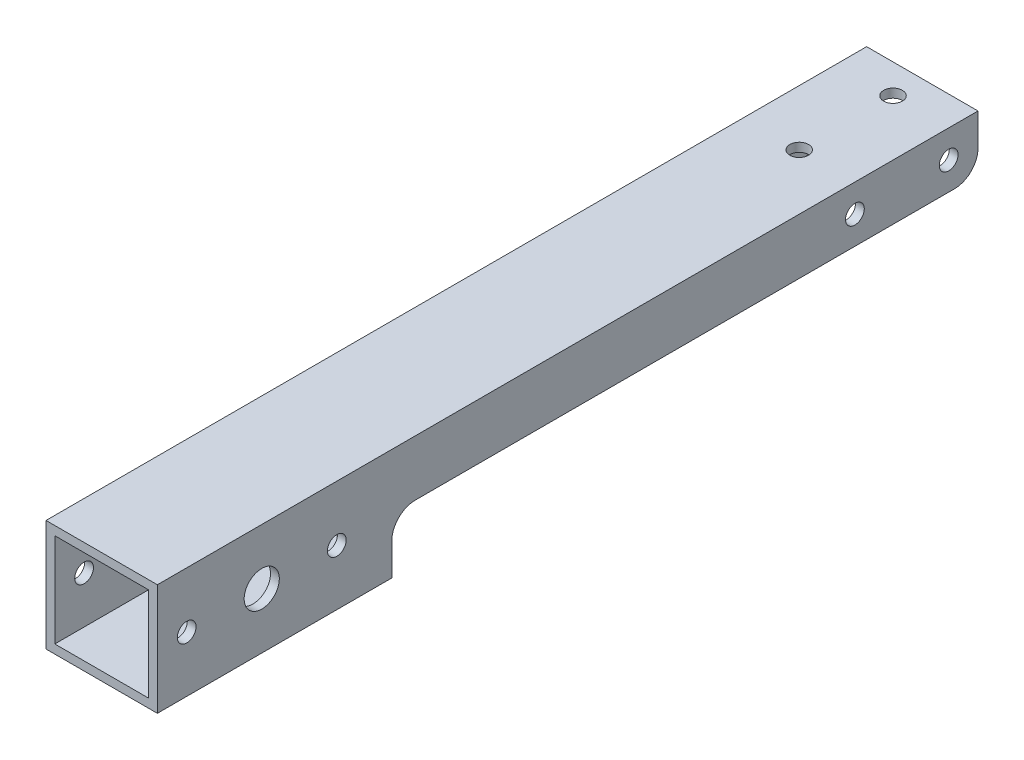
ISO-10303-21;
HEADER;
FILE_DESCRIPTION(('STEP AP214'),'2;1');
FILE_NAME('part.step','',(''),(''),'','','');
FILE_SCHEMA(('AUTOMOTIVE_DESIGN { 1 0 10303 214 1 1 1 1 }'));
ENDSEC;
DATA;
#1=APPLICATION_CONTEXT('core data for automotive mechanical design processes');
#2=APPLICATION_PROTOCOL_DEFINITION('international standard','automotive_design',2000,#1);
#3=PRODUCT_CONTEXT('',#1,'mechanical');
#4=PRODUCT('Part','Part','',(#3));
#5=PRODUCT_RELATED_PRODUCT_CATEGORY('part','',(#4));
#6=PRODUCT_DEFINITION_FORMATION('','',#4);
#7=PRODUCT_DEFINITION_CONTEXT('part definition',#1,'design');
#8=PRODUCT_DEFINITION('design','',#6,#7);
#9=PRODUCT_DEFINITION_SHAPE('','',#8);
#10=(LENGTH_UNIT() NAMED_UNIT(*) SI_UNIT(.MILLI.,.METRE.));
#11=(NAMED_UNIT(*) PLANE_ANGLE_UNIT() SI_UNIT($,.RADIAN.));
#12=(NAMED_UNIT(*) SI_UNIT($,.STERADIAN.) SOLID_ANGLE_UNIT());
#13=UNCERTAINTY_MEASURE_WITH_UNIT(LENGTH_MEASURE(1.E-05),#10,'distance_accuracy_value','');
#14=(GEOMETRIC_REPRESENTATION_CONTEXT(3) GLOBAL_UNCERTAINTY_ASSIGNED_CONTEXT((#13)) GLOBAL_UNIT_ASSIGNED_CONTEXT((#10,
#11,#12)) REPRESENTATION_CONTEXT('',''));
#15=CARTESIAN_POINT('',(0.,0.,0.));
#16=DIRECTION('',(0.,0.,1.));
#17=DIRECTION('',(1.,0.,0.));
#18=AXIS2_PLACEMENT_3D('',#15,#16,#17);
#19=CARTESIAN_POINT('',(-9.5,-9.5,140.));
#20=DIRECTION('',(0.,1.,0.));
#21=DIRECTION('',(0.,0.,1.));
#22=AXIS2_PLACEMENT_3D('',#19,#20,#21);
#23=PLANE('',#22);
#24=DIRECTION('',(1.,0.,0.));
#25=VECTOR('',#24,1.);
#26=CARTESIAN_POINT('',(-9.5,-9.5,100.));
#27=LINE('',#26,#25);
#28=CARTESIAN_POINT('',(-9.5,-9.5,100.));
#29=VERTEX_POINT('',#28);
#30=CARTESIAN_POINT('',(9.5,-9.5,100.));
#31=VERTEX_POINT('',#30);
#32=EDGE_CURVE('E173',#29,#31,#27,.T.);
#33=ORIENTED_EDGE('',*,*,#32,.T.);
#34=DIRECTION('',(0.,0.,-1.));
#35=VECTOR('',#34,1.);
#36=CARTESIAN_POINT('',(9.5,-9.5,140.));
#37=LINE('',#36,#35);
#38=CARTESIAN_POINT('',(9.5,-9.5,140.));
#39=VERTEX_POINT('',#38);
#40=EDGE_CURVE('E183',#39,#31,#37,.T.);
#41=ORIENTED_EDGE('',*,*,#40,.F.);
#42=DIRECTION('',(1.,0.,0.));
#43=VECTOR('',#42,1.);
#44=CARTESIAN_POINT('',(-9.5,-9.5,140.));
#45=LINE('',#44,#43);
#46=CARTESIAN_POINT('',(-9.5,-9.5,140.));
#47=VERTEX_POINT('',#46);
#48=EDGE_CURVE('E203',#47,#39,#45,.T.);
#49=ORIENTED_EDGE('',*,*,#48,.F.);
#50=DIRECTION('',(0.,0.,-1.));
#51=VECTOR('',#50,1.);
#52=CARTESIAN_POINT('',(-9.5,-9.5,140.));
#53=LINE('',#52,#51);
#54=EDGE_CURVE('E185',#47,#29,#53,.T.);
#55=ORIENTED_EDGE('',*,*,#54,.T.);
#56=EDGE_LOOP('',(#33,#41,#49,#55));
#57=FACE_BOUND('',#56,.T.);
#58=ADVANCED_FACE('F59',(#57),#23,.F.);
#59=CARTESIAN_POINT('',(8.,-8.,140.));
#60=DIRECTION('',(0.,-1.,0.));
#61=DIRECTION('',(0.,0.,-1.));
#62=AXIS2_PLACEMENT_3D('',#59,#60,#61);
#63=PLANE('',#62);
#64=DIRECTION('',(1.,0.,0.));
#65=VECTOR('',#64,1.);
#66=CARTESIAN_POINT('',(8.,-8.,100.));
#67=LINE('',#66,#65);
#68=CARTESIAN_POINT('',(-8.,-8.,100.));
#69=VERTEX_POINT('',#68);
#70=CARTESIAN_POINT('',(8.,-8.,100.));
#71=VERTEX_POINT('',#70);
#72=EDGE_CURVE('E269',#69,#71,#67,.T.);
#73=ORIENTED_EDGE('',*,*,#72,.F.);
#74=DIRECTION('',(0.,0.,-1.));
#75=VECTOR('',#74,1.);
#76=CARTESIAN_POINT('',(-8.,-8.,140.));
#77=LINE('',#76,#75);
#78=CARTESIAN_POINT('',(-8.,-8.,140.));
#79=VERTEX_POINT('',#78);
#80=EDGE_CURVE('E360',#79,#69,#77,.T.);
#81=ORIENTED_EDGE('',*,*,#80,.F.);
#82=DIRECTION('',(-1.,0.,0.));
#83=VECTOR('',#82,1.);
#84=CARTESIAN_POINT('',(8.,-8.,140.));
#85=LINE('',#84,#83);
#86=CARTESIAN_POINT('',(8.,-8.,140.));
#87=VERTEX_POINT('',#86);
#88=EDGE_CURVE('E344',#87,#79,#85,.T.);
#89=ORIENTED_EDGE('',*,*,#88,.F.);
#90=DIRECTION('',(0.,0.,-1.));
#91=VECTOR('',#90,1.);
#92=CARTESIAN_POINT('',(8.,-8.,140.));
#93=LINE('',#92,#91);
#94=EDGE_CURVE('E357',#87,#71,#93,.T.);
#95=ORIENTED_EDGE('',*,*,#94,.T.);
#96=EDGE_LOOP('',(#73,#81,#89,#95));
#97=FACE_BOUND('',#96,.T.);
#98=ADVANCED_FACE('F394',(#97),#63,.F.);
#99=CARTESIAN_POINT('',(0.,0.,140.));
#100=DIRECTION('',(0.,0.,-1.));
#101=DIRECTION('',(-1.,0.,0.));
#102=AXIS2_PLACEMENT_3D('',#99,#100,#101);
#103=PLANE('',#102);
#104=DIRECTION('',(0.,1.,0.));
#105=VECTOR('',#104,1.);
#106=CARTESIAN_POINT('',(-9.5,-9.5,140.));
#107=LINE('',#106,#105);
#108=CARTESIAN_POINT('',(-9.5,9.5,140.));
#109=VERTEX_POINT('',#108);
#110=EDGE_CURVE('E366',#47,#109,#107,.T.);
#111=ORIENTED_EDGE('',*,*,#110,.F.);
#112=ORIENTED_EDGE('',*,*,#48,.T.);
#113=DIRECTION('',(0.,1.,0.));
#114=VECTOR('',#113,1.);
#115=CARTESIAN_POINT('',(9.5,-9.5,140.));
#116=LINE('',#115,#114);
#117=CARTESIAN_POINT('',(9.5,9.5,140.));
#118=VERTEX_POINT('',#117);
#119=EDGE_CURVE('E191',#39,#118,#116,.T.);
#120=ORIENTED_EDGE('',*,*,#119,.T.);
#121=DIRECTION('',(1.,0.,0.));
#122=VECTOR('',#121,1.);
#123=CARTESIAN_POINT('',(-9.5,9.5,140.));
#124=LINE('',#123,#122);
#125=EDGE_CURVE('E369',#109,#118,#124,.T.);
#126=ORIENTED_EDGE('',*,*,#125,.F.);
#127=EDGE_LOOP('',(#111,#112,#120,#126));
#128=FACE_BOUND('',#127,.T.);
#129=DIRECTION('',(-1.,0.,0.));
#130=VECTOR('',#129,1.);
#131=CARTESIAN_POINT('',(8.,8.,140.));
#132=LINE('',#131,#130);
#133=CARTESIAN_POINT('',(8.,8.,140.));
#134=VERTEX_POINT('',#133);
#135=CARTESIAN_POINT('',(-8.,8.,140.));
#136=VERTEX_POINT('',#135);
#137=EDGE_CURVE('E338',#134,#136,#132,.T.);
#138=ORIENTED_EDGE('',*,*,#137,.F.);
#139=DIRECTION('',(0.,1.,0.));
#140=VECTOR('',#139,1.);
#141=CARTESIAN_POINT('',(8.,-8.,140.));
#142=LINE('',#141,#140);
#143=EDGE_CURVE('E347',#87,#134,#142,.T.);
#144=ORIENTED_EDGE('',*,*,#143,.F.);
#145=ORIENTED_EDGE('',*,*,#88,.T.);
#146=DIRECTION('',(0.,1.,0.));
#147=VECTOR('',#146,1.);
#148=CARTESIAN_POINT('',(-8.,-8.,140.));
#149=LINE('',#148,#147);
#150=EDGE_CURVE('E340',#79,#136,#149,.T.);
#151=ORIENTED_EDGE('',*,*,#150,.T.);
#152=EDGE_LOOP('',(#138,#144,#145,#151));
#153=FACE_BOUND('',#152,.T.);
#154=ADVANCED_FACE('F391',(#128,#153),#103,.F.);
#155=CARTESIAN_POINT('',(0.,0.,0.));
#156=DIRECTION('',(0.,0.,-1.));
#157=DIRECTION('',(-1.,0.,0.));
#158=AXIS2_PLACEMENT_3D('',#155,#156,#157);
#159=PLANE('',#158);
#160=DIRECTION('',(0.,1.,0.));
#161=VECTOR('',#160,1.);
#162=CARTESIAN_POINT('',(-8.,-8.,0.));
#163=LINE('',#162,#161);
#164=CARTESIAN_POINT('',(-8.,4.,0.));
#165=VERTEX_POINT('',#164);
#166=CARTESIAN_POINT('',(-8.,8.,0.));
#167=VERTEX_POINT('',#166);
#168=EDGE_CURVE('E352',#165,#167,#163,.T.);
#169=ORIENTED_EDGE('',*,*,#168,.F.);
#170=DIRECTION('',(1.,0.,0.));
#171=VECTOR('',#170,1.);
#172=CARTESIAN_POINT('',(-9.5,4.,0.));
#173=LINE('',#172,#171);
#174=CARTESIAN_POINT('',(-9.5,4.,0.));
#175=VERTEX_POINT('',#174);
#176=EDGE_CURVE('E239',#165,#175,#173,.F.);
#177=ORIENTED_EDGE('',*,*,#176,.T.);
#178=DIRECTION('',(0.,1.,0.));
#179=VECTOR('',#178,1.);
#180=CARTESIAN_POINT('',(-9.5,-9.5,0.));
#181=LINE('',#180,#179);
#182=CARTESIAN_POINT('',(-9.5,9.5,0.));
#183=VERTEX_POINT('',#182);
#184=EDGE_CURVE('E365',#175,#183,#181,.T.);
#185=ORIENTED_EDGE('',*,*,#184,.T.);
#186=DIRECTION('',(1.,0.,0.));
#187=VECTOR('',#186,1.);
#188=CARTESIAN_POINT('',(-9.5,9.5,0.));
#189=LINE('',#188,#187);
#190=CARTESIAN_POINT('',(9.5,9.5,0.));
#191=VERTEX_POINT('',#190);
#192=EDGE_CURVE('E376',#183,#191,#189,.T.);
#193=ORIENTED_EDGE('',*,*,#192,.T.);
#194=DIRECTION('',(0.,1.,0.));
#195=VECTOR('',#194,1.);
#196=CARTESIAN_POINT('',(9.5,-9.5,0.));
#197=LINE('',#196,#195);
#198=CARTESIAN_POINT('',(9.5,4.,0.));
#199=VERTEX_POINT('',#198);
#200=EDGE_CURVE('E370',#199,#191,#197,.T.);
#201=ORIENTED_EDGE('',*,*,#200,.F.);
#202=DIRECTION('',(1.,0.,0.));
#203=VECTOR('',#202,1.);
#204=CARTESIAN_POINT('',(8.,4.,0.));
#205=LINE('',#204,#203);
#206=CARTESIAN_POINT('',(8.,4.,0.));
#207=VERTEX_POINT('',#206);
#208=EDGE_CURVE('E237',#199,#207,#205,.F.);
#209=ORIENTED_EDGE('',*,*,#208,.T.);
#210=DIRECTION('',(0.,1.,0.));
#211=VECTOR('',#210,1.);
#212=CARTESIAN_POINT('',(8.,-8.,0.));
#213=LINE('',#212,#211);
#214=CARTESIAN_POINT('',(8.,8.,0.));
#215=VERTEX_POINT('',#214);
#216=EDGE_CURVE('E341',#207,#215,#213,.T.);
#217=ORIENTED_EDGE('',*,*,#216,.T.);
#218=DIRECTION('',(-1.,0.,0.));
#219=VECTOR('',#218,1.);
#220=CARTESIAN_POINT('',(8.,8.,0.));
#221=LINE('',#220,#219);
#222=EDGE_CURVE('E337',#215,#167,#221,.T.);
#223=ORIENTED_EDGE('',*,*,#222,.T.);
#224=EDGE_LOOP('',(#169,#177,#185,#193,#201,#209,#217,#223));
#225=FACE_BOUND('',#224,.T.);
#226=ADVANCED_FACE('F386',(#225),#159,.T.);
#227=CARTESIAN_POINT('',(-9.5,-9.5,140.));
#228=DIRECTION('',(-1.,0.,0.));
#229=DIRECTION('',(0.,0.,1.));
#230=AXIS2_PLACEMENT_3D('',#227,#228,#229);
#231=PLANE('',#230);
#232=ORIENTED_EDGE('',*,*,#184,.F.);
#233=CARTESIAN_POINT('',(-9.5,4.,4.));
#234=DIRECTION('',(-1.,0.,0.));
#235=DIRECTION('',(0.,0.,1.));
#236=AXIS2_PLACEMENT_3D('',#233,#234,#235);
#237=CIRCLE('',#236,4.);
#238=CARTESIAN_POINT('',(-9.5,0.,4.));
#239=VERTEX_POINT('',#238);
#240=EDGE_CURVE('E241',#175,#239,#237,.T.);
#241=ORIENTED_EDGE('',*,*,#240,.T.);
#242=DIRECTION('',(0.,0.,-1.));
#243=VECTOR('',#242,1.);
#244=CARTESIAN_POINT('',(-9.5,0.,161.242645786248));
#245=LINE('',#244,#243);
#246=CARTESIAN_POINT('',(-9.5,0.,96.));
#247=VERTEX_POINT('',#246);
#248=EDGE_CURVE('E264',#247,#239,#245,.T.);
#249=ORIENTED_EDGE('',*,*,#248,.F.);
#250=CARTESIAN_POINT('',(-9.5,-4.,96.));
#251=DIRECTION('',(-1.,0.,0.));
#252=DIRECTION('',(0.,0.,1.));
#253=AXIS2_PLACEMENT_3D('',#250,#251,#252);
#254=CIRCLE('',#253,4.);
#255=CARTESIAN_POINT('',(-9.5,-4.,100.));
#256=VERTEX_POINT('',#255);
#257=EDGE_CURVE('E67',#247,#256,#254,.F.);
#258=ORIENTED_EDGE('',*,*,#257,.T.);
#259=DIRECTION('',(0.,-1.,0.));
#260=VECTOR('',#259,1.);
#261=CARTESIAN_POINT('',(-9.5,-9.5,100.));
#262=LINE('',#261,#260);
#263=EDGE_CURVE('E186',#256,#29,#262,.T.);
#264=ORIENTED_EDGE('',*,*,#263,.T.);
#265=ORIENTED_EDGE('',*,*,#54,.F.);
#266=ORIENTED_EDGE('',*,*,#110,.T.);
#267=DIRECTION('',(0.,0.,-1.));
#268=VECTOR('',#267,1.);
#269=CARTESIAN_POINT('',(-9.5,9.5,140.));
#270=LINE('',#269,#268);
#271=EDGE_CURVE('E197',#109,#183,#270,.T.);
#272=ORIENTED_EDGE('',*,*,#271,.T.);
#273=EDGE_LOOP('',(#232,#241,#249,#258,#264,#265,#266,#272));
#274=FACE_BOUND('',#273,.T.);
#275=CARTESIAN_POINT('',(-9.5,4.75,21.));
#276=DIRECTION('',(1.,0.,0.));
#277=DIRECTION('',(0.,0.,-1.));
#278=AXIS2_PLACEMENT_3D('',#275,#276,#277);
#279=CIRCLE('',#278,1.6);
#280=CARTESIAN_POINT('',(-9.5,4.75,19.4));
#281=VERTEX_POINT('',#280);
#282=EDGE_CURVE('E295',#281,#281,#279,.T.);
#283=ORIENTED_EDGE('',*,*,#282,.T.);
#284=EDGE_LOOP('',(#283));
#285=FACE_BOUND('',#284,.T.);
#286=CARTESIAN_POINT('',(-9.5,4.75,5.));
#287=DIRECTION('',(1.,0.,0.));
#288=DIRECTION('',(0.,0.,-1.));
#289=AXIS2_PLACEMENT_3D('',#286,#287,#288);
#290=CIRCLE('',#289,1.6);
#291=CARTESIAN_POINT('',(-9.5,4.75,3.4));
#292=VERTEX_POINT('',#291);
#293=EDGE_CURVE('E315',#292,#292,#290,.T.);
#294=ORIENTED_EDGE('',*,*,#293,.T.);
#295=EDGE_LOOP('',(#294));
#296=FACE_BOUND('',#295,.T.);
#297=CARTESIAN_POINT('',(-9.5,0.,122.193751525134));
#298=DIRECTION('',(1.,0.,0.));
#299=DIRECTION('',(0.,0.,-1.));
#300=AXIS2_PLACEMENT_3D('',#297,#298,#299);
#301=CIRCLE('',#300,3.00000000000001);
#302=CARTESIAN_POINT('',(-9.5,0.,119.193751525134));
#303=VERTEX_POINT('',#302);
#304=EDGE_CURVE('E309',#303,#303,#301,.T.);
#305=ORIENTED_EDGE('',*,*,#304,.T.);
#306=EDGE_LOOP('',(#305));
#307=FACE_BOUND('',#306,.T.);
#308=CARTESIAN_POINT('',(-9.5,0.,135.));
#309=DIRECTION('',(1.,0.,0.));
#310=DIRECTION('',(0.,0.,-1.));
#311=AXIS2_PLACEMENT_3D('',#308,#309,#310);
#312=CIRCLE('',#311,1.59999999999999);
#313=CARTESIAN_POINT('',(-9.5,0.,133.4));
#314=VERTEX_POINT('',#313);
#315=EDGE_CURVE('E303',#314,#314,#312,.T.);
#316=ORIENTED_EDGE('',*,*,#315,.T.);
#317=EDGE_LOOP('',(#316));
#318=FACE_BOUND('',#317,.T.);
#319=CARTESIAN_POINT('',(-9.5,0.,109.387503050269));
#320=DIRECTION('',(1.,0.,0.));
#321=DIRECTION('',(0.,0.,-1.));
#322=AXIS2_PLACEMENT_3D('',#319,#320,#321);
#323=CIRCLE('',#322,1.60000000000001);
#324=CARTESIAN_POINT('',(-9.5,0.,107.787503050269));
#325=VERTEX_POINT('',#324);
#326=EDGE_CURVE('E208',#325,#325,#323,.T.);
#327=ORIENTED_EDGE('',*,*,#326,.T.);
#328=EDGE_LOOP('',(#327));
#329=FACE_BOUND('',#328,.T.);
#330=ADVANCED_FACE('F261',(#274,#285,#296,#307,#318,#329),#231,.T.);
#331=CARTESIAN_POINT('',(9.5,-9.5,140.));
#332=DIRECTION('',(-1.,0.,0.));
#333=DIRECTION('',(0.,0.,1.));
#334=AXIS2_PLACEMENT_3D('',#331,#332,#333);
#335=PLANE('',#334);
#336=CARTESIAN_POINT('',(9.5,4.75,21.));
#337=DIRECTION('',(1.,0.,0.));
#338=DIRECTION('',(0.,0.,-1.));
#339=AXIS2_PLACEMENT_3D('',#336,#337,#338);
#340=CIRCLE('',#339,1.6);
#341=CARTESIAN_POINT('',(9.5,4.75,19.4));
#342=VERTEX_POINT('',#341);
#343=EDGE_CURVE('E318',#342,#342,#340,.T.);
#344=ORIENTED_EDGE('',*,*,#343,.F.);
#345=EDGE_LOOP('',(#344));
#346=FACE_BOUND('',#345,.T.);
#347=CARTESIAN_POINT('',(9.5,4.75,5.));
#348=DIRECTION('',(1.,0.,0.));
#349=DIRECTION('',(0.,0.,-1.));
#350=AXIS2_PLACEMENT_3D('',#347,#348,#349);
#351=CIRCLE('',#350,1.6);
#352=CARTESIAN_POINT('',(9.5,4.75,3.4));
#353=VERTEX_POINT('',#352);
#354=EDGE_CURVE('E312',#353,#353,#351,.T.);
#355=ORIENTED_EDGE('',*,*,#354,.F.);
#356=EDGE_LOOP('',(#355));
#357=FACE_BOUND('',#356,.T.);
#358=CARTESIAN_POINT('',(9.5,0.,122.193751525134));
#359=DIRECTION('',(1.,0.,0.));
#360=DIRECTION('',(0.,0.,-1.));
#361=AXIS2_PLACEMENT_3D('',#358,#359,#360);
#362=CIRCLE('',#361,3.00000000000001);
#363=CARTESIAN_POINT('',(9.5,0.,119.193751525134));
#364=VERTEX_POINT('',#363);
#365=EDGE_CURVE('E306',#364,#364,#362,.T.);
#366=ORIENTED_EDGE('',*,*,#365,.F.);
#367=EDGE_LOOP('',(#366));
#368=FACE_BOUND('',#367,.T.);
#369=CARTESIAN_POINT('',(9.5,0.,135.));
#370=DIRECTION('',(1.,0.,0.));
#371=DIRECTION('',(0.,0.,-1.));
#372=AXIS2_PLACEMENT_3D('',#369,#370,#371);
#373=CIRCLE('',#372,1.59999999999999);
#374=CARTESIAN_POINT('',(9.5,0.,133.4));
#375=VERTEX_POINT('',#374);
#376=EDGE_CURVE('E299',#375,#375,#373,.T.);
#377=ORIENTED_EDGE('',*,*,#376,.F.);
#378=EDGE_LOOP('',(#377));
#379=FACE_BOUND('',#378,.T.);
#380=CARTESIAN_POINT('',(9.5,0.,109.387503050269));
#381=DIRECTION('',(1.,0.,0.));
#382=DIRECTION('',(0.,0.,-1.));
#383=AXIS2_PLACEMENT_3D('',#380,#381,#382);
#384=CIRCLE('',#383,1.60000000000001);
#385=CARTESIAN_POINT('',(9.5,0.,107.787503050269));
#386=VERTEX_POINT('',#385);
#387=EDGE_CURVE('E302',#386,#386,#384,.T.);
#388=ORIENTED_EDGE('',*,*,#387,.F.);
#389=EDGE_LOOP('',(#388));
#390=FACE_BOUND('',#389,.T.);
#391=DIRECTION('',(0.,0.,-1.));
#392=VECTOR('',#391,1.);
#393=CARTESIAN_POINT('',(9.5,0.,161.242645786248));
#394=LINE('',#393,#392);
#395=CARTESIAN_POINT('',(9.5,0.,96.));
#396=VERTEX_POINT('',#395);
#397=CARTESIAN_POINT('',(9.5,0.,4.));
#398=VERTEX_POINT('',#397);
#399=EDGE_CURVE('E178',#396,#398,#394,.T.);
#400=ORIENTED_EDGE('',*,*,#399,.T.);
#401=CARTESIAN_POINT('',(9.5,4.,4.));
#402=DIRECTION('',(-1.,0.,0.));
#403=DIRECTION('',(0.,0.,1.));
#404=AXIS2_PLACEMENT_3D('',#401,#402,#403);
#405=CIRCLE('',#404,4.);
#406=EDGE_CURVE('E249',#398,#199,#405,.F.);
#407=ORIENTED_EDGE('',*,*,#406,.T.);
#408=ORIENTED_EDGE('',*,*,#200,.T.);
#409=DIRECTION('',(0.,0.,-1.));
#410=VECTOR('',#409,1.);
#411=CARTESIAN_POINT('',(9.5,9.5,140.));
#412=LINE('',#411,#410);
#413=EDGE_CURVE('E192',#118,#191,#412,.T.);
#414=ORIENTED_EDGE('',*,*,#413,.F.);
#415=ORIENTED_EDGE('',*,*,#119,.F.);
#416=ORIENTED_EDGE('',*,*,#40,.T.);
#417=DIRECTION('',(0.,1.,0.));
#418=VECTOR('',#417,1.);
#419=CARTESIAN_POINT('',(9.5,-9.5,100.));
#420=LINE('',#419,#418);
#421=CARTESIAN_POINT('',(9.5,-4.,100.));
#422=VERTEX_POINT('',#421);
#423=EDGE_CURVE('E169',#31,#422,#420,.T.);
#424=ORIENTED_EDGE('',*,*,#423,.T.);
#425=CARTESIAN_POINT('',(9.5,-4.,96.));
#426=DIRECTION('',(-1.,0.,0.));
#427=DIRECTION('',(0.,0.,1.));
#428=AXIS2_PLACEMENT_3D('',#425,#426,#427);
#429=CIRCLE('',#428,4.);
#430=EDGE_CURVE('E257',#422,#396,#429,.T.);
#431=ORIENTED_EDGE('',*,*,#430,.T.);
#432=EDGE_LOOP('',(#400,#407,#408,#414,#415,#416,#424,#431));
#433=FACE_BOUND('',#432,.T.);
#434=ADVANCED_FACE('F189',(#346,#357,#368,#379,#390,#433),#335,.F.);
#435=CARTESIAN_POINT('',(-9.5,9.5,140.));
#436=DIRECTION('',(0.,1.,0.));
#437=DIRECTION('',(0.,0.,1.));
#438=AXIS2_PLACEMENT_3D('',#435,#436,#437);
#439=PLANE('',#438);
#440=CARTESIAN_POINT('',(0.,9.5,21.));
#441=DIRECTION('',(0.,1.,0.));
#442=DIRECTION('',(0.,0.,1.));
#443=AXIS2_PLACEMENT_3D('',#440,#441,#442);
#444=CIRCLE('',#443,1.6);
#445=CARTESIAN_POINT('',(0.,9.5,22.6));
#446=VERTEX_POINT('',#445);
#447=EDGE_CURVE('E290',#446,#446,#444,.T.);
#448=ORIENTED_EDGE('',*,*,#447,.F.);
#449=EDGE_LOOP('',(#448));
#450=FACE_BOUND('',#449,.T.);
#451=CARTESIAN_POINT('',(0.,9.5,5.));
#452=DIRECTION('',(0.,1.,0.));
#453=DIRECTION('',(0.,0.,1.));
#454=AXIS2_PLACEMENT_3D('',#451,#452,#453);
#455=CIRCLE('',#454,1.6);
#456=CARTESIAN_POINT('',(0.,9.5,6.6));
#457=VERTEX_POINT('',#456);
#458=EDGE_CURVE('E282',#457,#457,#455,.T.);
#459=ORIENTED_EDGE('',*,*,#458,.F.);
#460=EDGE_LOOP('',(#459));
#461=FACE_BOUND('',#460,.T.);
#462=ORIENTED_EDGE('',*,*,#192,.F.);
#463=ORIENTED_EDGE('',*,*,#271,.F.);
#464=ORIENTED_EDGE('',*,*,#125,.T.);
#465=ORIENTED_EDGE('',*,*,#413,.T.);
#466=EDGE_LOOP('',(#462,#463,#464,#465));
#467=FACE_BOUND('',#466,.T.);
#468=ADVANCED_FACE('F383',(#450,#461,#467),#439,.T.);
#469=CARTESIAN_POINT('',(8.,8.,140.));
#470=DIRECTION('',(0.,-1.,0.));
#471=DIRECTION('',(0.,0.,-1.));
#472=AXIS2_PLACEMENT_3D('',#469,#470,#471);
#473=PLANE('',#472);
#474=CARTESIAN_POINT('',(0.,8.,21.));
#475=DIRECTION('',(0.,-1.,0.));
#476=DIRECTION('',(0.,0.,-1.));
#477=AXIS2_PLACEMENT_3D('',#474,#475,#476);
#478=CIRCLE('',#477,1.6);
#479=CARTESIAN_POINT('',(0.,8.,19.4));
#480=VERTEX_POINT('',#479);
#481=EDGE_CURVE('E293',#480,#480,#478,.F.);
#482=ORIENTED_EDGE('',*,*,#481,.T.);
#483=EDGE_LOOP('',(#482));
#484=FACE_BOUND('',#483,.T.);
#485=CARTESIAN_POINT('',(0.,8.,5.));
#486=DIRECTION('',(0.,-1.,0.));
#487=DIRECTION('',(0.,0.,-1.));
#488=AXIS2_PLACEMENT_3D('',#485,#486,#487);
#489=CIRCLE('',#488,1.6);
#490=CARTESIAN_POINT('',(0.,8.,3.4));
#491=VERTEX_POINT('',#490);
#492=EDGE_CURVE('E285',#491,#491,#489,.F.);
#493=ORIENTED_EDGE('',*,*,#492,.T.);
#494=EDGE_LOOP('',(#493));
#495=FACE_BOUND('',#494,.T.);
#496=ORIENTED_EDGE('',*,*,#222,.F.);
#497=DIRECTION('',(0.,0.,-1.));
#498=VECTOR('',#497,1.);
#499=CARTESIAN_POINT('',(8.,8.,140.));
#500=LINE('',#499,#498);
#501=EDGE_CURVE('E349',#134,#215,#500,.T.);
#502=ORIENTED_EDGE('',*,*,#501,.F.);
#503=ORIENTED_EDGE('',*,*,#137,.T.);
#504=DIRECTION('',(0.,0.,-1.));
#505=VECTOR('',#504,1.);
#506=CARTESIAN_POINT('',(-8.,8.,140.));
#507=LINE('',#506,#505);
#508=EDGE_CURVE('E362',#136,#167,#507,.T.);
#509=ORIENTED_EDGE('',*,*,#508,.T.);
#510=EDGE_LOOP('',(#496,#502,#503,#509));
#511=FACE_BOUND('',#510,.T.);
#512=ADVANCED_FACE('F403',(#484,#495,#511),#473,.T.);
#513=CARTESIAN_POINT('',(-8.,-8.,140.));
#514=DIRECTION('',(-1.,0.,0.));
#515=DIRECTION('',(0.,0.,1.));
#516=AXIS2_PLACEMENT_3D('',#513,#514,#515);
#517=PLANE('',#516);
#518=CARTESIAN_POINT('',(-8.,4.75,21.));
#519=DIRECTION('',(-1.,0.,0.));
#520=DIRECTION('',(0.,0.,1.));
#521=AXIS2_PLACEMENT_3D('',#518,#519,#520);
#522=CIRCLE('',#521,1.6);
#523=CARTESIAN_POINT('',(-8.,4.75,22.6));
#524=VERTEX_POINT('',#523);
#525=EDGE_CURVE('E224',#524,#524,#522,.T.);
#526=ORIENTED_EDGE('',*,*,#525,.T.);
#527=EDGE_LOOP('',(#526));
#528=FACE_BOUND('',#527,.T.);
#529=CARTESIAN_POINT('',(-8.,4.75,5.));
#530=DIRECTION('',(-1.,0.,0.));
#531=DIRECTION('',(0.,0.,1.));
#532=AXIS2_PLACEMENT_3D('',#529,#530,#531);
#533=CIRCLE('',#532,1.6);
#534=CARTESIAN_POINT('',(-8.,4.75,6.6));
#535=VERTEX_POINT('',#534);
#536=EDGE_CURVE('E220',#535,#535,#533,.T.);
#537=ORIENTED_EDGE('',*,*,#536,.T.);
#538=EDGE_LOOP('',(#537));
#539=FACE_BOUND('',#538,.T.);
#540=CARTESIAN_POINT('',(-8.,0.,122.193751525134));
#541=DIRECTION('',(-1.,0.,0.));
#542=DIRECTION('',(0.,0.,1.));
#543=AXIS2_PLACEMENT_3D('',#540,#541,#542);
#544=CIRCLE('',#543,3.00000000000001);
#545=CARTESIAN_POINT('',(-8.,0.,125.193751525134));
#546=VERTEX_POINT('',#545);
#547=EDGE_CURVE('E216',#546,#546,#544,.T.);
#548=ORIENTED_EDGE('',*,*,#547,.T.);
#549=EDGE_LOOP('',(#548));
#550=FACE_BOUND('',#549,.T.);
#551=CARTESIAN_POINT('',(-8.,0.,135.));
#552=DIRECTION('',(-1.,0.,0.));
#553=DIRECTION('',(0.,0.,1.));
#554=AXIS2_PLACEMENT_3D('',#551,#552,#553);
#555=CIRCLE('',#554,1.59999999999999);
#556=CARTESIAN_POINT('',(-8.,0.,136.6));
#557=VERTEX_POINT('',#556);
#558=EDGE_CURVE('E212',#557,#557,#555,.T.);
#559=ORIENTED_EDGE('',*,*,#558,.T.);
#560=EDGE_LOOP('',(#559));
#561=FACE_BOUND('',#560,.T.);
#562=CARTESIAN_POINT('',(-8.,0.,109.387503050269));
#563=DIRECTION('',(-1.,0.,0.));
#564=DIRECTION('',(0.,0.,1.));
#565=AXIS2_PLACEMENT_3D('',#562,#563,#564);
#566=CIRCLE('',#565,1.60000000000001);
#567=CARTESIAN_POINT('',(-8.,0.,110.987503050269));
#568=VERTEX_POINT('',#567);
#569=EDGE_CURVE('E207',#568,#568,#566,.T.);
#570=ORIENTED_EDGE('',*,*,#569,.T.);
#571=EDGE_LOOP('',(#570));
#572=FACE_BOUND('',#571,.T.);
#573=DIRECTION('',(0.,0.,-1.));
#574=VECTOR('',#573,1.);
#575=CARTESIAN_POINT('',(-8.,0.,140.));
#576=LINE('',#575,#574);
#577=CARTESIAN_POINT('',(-8.,0.,96.));
#578=VERTEX_POINT('',#577);
#579=CARTESIAN_POINT('',(-8.,0.,4.));
#580=VERTEX_POINT('',#579);
#581=EDGE_CURVE('E276',#578,#580,#576,.T.);
#582=ORIENTED_EDGE('',*,*,#581,.T.);
#583=CARTESIAN_POINT('',(-8.,4.,4.));
#584=DIRECTION('',(-1.,0.,0.));
#585=DIRECTION('',(0.,0.,1.));
#586=AXIS2_PLACEMENT_3D('',#583,#584,#585);
#587=CIRCLE('',#586,4.);
#588=EDGE_CURVE('E235',#580,#165,#587,.F.);
#589=ORIENTED_EDGE('',*,*,#588,.T.);
#590=ORIENTED_EDGE('',*,*,#168,.T.);
#591=ORIENTED_EDGE('',*,*,#508,.F.);
#592=ORIENTED_EDGE('',*,*,#150,.F.);
#593=ORIENTED_EDGE('',*,*,#80,.T.);
#594=DIRECTION('',(0.,-1.,0.));
#595=VECTOR('',#594,1.);
#596=CARTESIAN_POINT('',(-8.,-8.,100.));
#597=LINE('',#596,#595);
#598=CARTESIAN_POINT('',(-8.,-4.,100.));
#599=VERTEX_POINT('',#598);
#600=EDGE_CURVE('E278',#599,#69,#597,.T.);
#601=ORIENTED_EDGE('',*,*,#600,.F.);
#602=CARTESIAN_POINT('',(-8.,-4.,96.));
#603=DIRECTION('',(-1.,0.,0.));
#604=DIRECTION('',(0.,0.,1.));
#605=AXIS2_PLACEMENT_3D('',#602,#603,#604);
#606=CIRCLE('',#605,4.);
#607=EDGE_CURVE('E13',#599,#578,#606,.T.);
#608=ORIENTED_EDGE('',*,*,#607,.T.);
#609=EDGE_LOOP('',(#582,#589,#590,#591,#592,#593,#601,#608));
#610=FACE_BOUND('',#609,.T.);
#611=ADVANCED_FACE('F275',(#528,#539,#550,#561,#572,#610),#517,.F.);
#612=CARTESIAN_POINT('',(8.,-8.,140.));
#613=DIRECTION('',(-1.,0.,0.));
#614=DIRECTION('',(0.,0.,1.));
#615=AXIS2_PLACEMENT_3D('',#612,#613,#614);
#616=PLANE('',#615);
#617=ORIENTED_EDGE('',*,*,#216,.F.);
#618=CARTESIAN_POINT('',(8.,4.,4.));
#619=DIRECTION('',(-1.,0.,0.));
#620=DIRECTION('',(0.,0.,1.));
#621=AXIS2_PLACEMENT_3D('',#618,#619,#620);
#622=CIRCLE('',#621,4.);
#623=CARTESIAN_POINT('',(8.,0.,4.));
#624=VERTEX_POINT('',#623);
#625=EDGE_CURVE('E251',#207,#624,#622,.T.);
#626=ORIENTED_EDGE('',*,*,#625,.T.);
#627=DIRECTION('',(0.,0.,-1.));
#628=VECTOR('',#627,1.);
#629=CARTESIAN_POINT('',(8.,0.,140.));
#630=LINE('',#629,#628);
#631=CARTESIAN_POINT('',(8.,0.,96.));
#632=VERTEX_POINT('',#631);
#633=EDGE_CURVE('E226',#632,#624,#630,.T.);
#634=ORIENTED_EDGE('',*,*,#633,.F.);
#635=CARTESIAN_POINT('',(8.,-4.,96.));
#636=DIRECTION('',(-1.,0.,0.));
#637=DIRECTION('',(0.,0.,1.));
#638=AXIS2_PLACEMENT_3D('',#635,#636,#637);
#639=CIRCLE('',#638,4.);
#640=CARTESIAN_POINT('',(8.,-4.,100.));
#641=VERTEX_POINT('',#640);
#642=EDGE_CURVE('E74',#632,#641,#639,.F.);
#643=ORIENTED_EDGE('',*,*,#642,.T.);
#644=DIRECTION('',(0.,-1.,0.));
#645=VECTOR('',#644,1.);
#646=CARTESIAN_POINT('',(8.,-8.,100.));
#647=LINE('',#646,#645);
#648=EDGE_CURVE('E194',#641,#71,#647,.T.);
#649=ORIENTED_EDGE('',*,*,#648,.T.);
#650=ORIENTED_EDGE('',*,*,#94,.F.);
#651=ORIENTED_EDGE('',*,*,#143,.T.);
#652=ORIENTED_EDGE('',*,*,#501,.T.);
#653=EDGE_LOOP('',(#617,#626,#634,#643,#649,#650,#651,#652));
#654=FACE_BOUND('',#653,.T.);
#655=CARTESIAN_POINT('',(8.,4.75,21.));
#656=DIRECTION('',(-1.,0.,0.));
#657=DIRECTION('',(0.,0.,1.));
#658=AXIS2_PLACEMENT_3D('',#655,#656,#657);
#659=CIRCLE('',#658,1.6);
#660=CARTESIAN_POINT('',(8.,4.75,22.6));
#661=VERTEX_POINT('',#660);
#662=EDGE_CURVE('E221',#661,#661,#659,.T.);
#663=ORIENTED_EDGE('',*,*,#662,.F.);
#664=EDGE_LOOP('',(#663));
#665=FACE_BOUND('',#664,.T.);
#666=CARTESIAN_POINT('',(8.,4.75,5.));
#667=DIRECTION('',(-1.,0.,0.));
#668=DIRECTION('',(0.,0.,1.));
#669=AXIS2_PLACEMENT_3D('',#666,#667,#668);
#670=CIRCLE('',#669,1.6);
#671=CARTESIAN_POINT('',(8.,4.75,6.6));
#672=VERTEX_POINT('',#671);
#673=EDGE_CURVE('E217',#672,#672,#670,.T.);
#674=ORIENTED_EDGE('',*,*,#673,.F.);
#675=EDGE_LOOP('',(#674));
#676=FACE_BOUND('',#675,.T.);
#677=CARTESIAN_POINT('',(8.,0.,122.193751525134));
#678=DIRECTION('',(-1.,0.,0.));
#679=DIRECTION('',(0.,0.,1.));
#680=AXIS2_PLACEMENT_3D('',#677,#678,#679);
#681=CIRCLE('',#680,3.00000000000001);
#682=CARTESIAN_POINT('',(8.,0.,125.193751525134));
#683=VERTEX_POINT('',#682);
#684=EDGE_CURVE('E213',#683,#683,#681,.T.);
#685=ORIENTED_EDGE('',*,*,#684,.F.);
#686=EDGE_LOOP('',(#685));
#687=FACE_BOUND('',#686,.T.);
#688=CARTESIAN_POINT('',(8.,0.,135.));
#689=DIRECTION('',(-1.,0.,0.));
#690=DIRECTION('',(0.,0.,1.));
#691=AXIS2_PLACEMENT_3D('',#688,#689,#690);
#692=CIRCLE('',#691,1.59999999999999);
#693=CARTESIAN_POINT('',(8.,0.,136.6));
#694=VERTEX_POINT('',#693);
#695=EDGE_CURVE('E209',#694,#694,#692,.T.);
#696=ORIENTED_EDGE('',*,*,#695,.F.);
#697=EDGE_LOOP('',(#696));
#698=FACE_BOUND('',#697,.T.);
#699=CARTESIAN_POINT('',(8.,0.,109.387503050269));
#700=DIRECTION('',(-1.,0.,0.));
#701=DIRECTION('',(0.,0.,1.));
#702=AXIS2_PLACEMENT_3D('',#699,#700,#701);
#703=CIRCLE('',#702,1.60000000000001);
#704=CARTESIAN_POINT('',(8.,0.,110.987503050269));
#705=VERTEX_POINT('',#704);
#706=EDGE_CURVE('E204',#705,#705,#703,.T.);
#707=ORIENTED_EDGE('',*,*,#706,.F.);
#708=EDGE_LOOP('',(#707));
#709=FACE_BOUND('',#708,.T.);
#710=ADVANCED_FACE('F413',(#654,#665,#676,#687,#698,#709),#616,.T.);
#711=CARTESIAN_POINT('',(-9.5,0.,109.387503050269));
#712=DIRECTION('',(1.,0.,0.));
#713=DIRECTION('',(0.,0.,-1.));
#714=AXIS2_PLACEMENT_3D('',#711,#712,#713);
#715=CYLINDRICAL_SURFACE('',#714,1.60000000000001);
#716=ORIENTED_EDGE('',*,*,#706,.T.);
#717=EDGE_LOOP('',(#716));
#718=FACE_BOUND('',#717,.T.);
#719=ORIENTED_EDGE('',*,*,#387,.T.);
#720=EDGE_LOOP('',(#719));
#721=FACE_BOUND('',#720,.T.);
#722=ADVANCED_FACE('F476',(#718,#721),#715,.F.);
#723=CARTESIAN_POINT('',(-9.5,0.,135.));
#724=DIRECTION('',(1.,0.,0.));
#725=DIRECTION('',(0.,0.,-1.));
#726=AXIS2_PLACEMENT_3D('',#723,#724,#725);
#727=CYLINDRICAL_SURFACE('',#726,1.59999999999999);
#728=ORIENTED_EDGE('',*,*,#695,.T.);
#729=EDGE_LOOP('',(#728));
#730=FACE_BOUND('',#729,.T.);
#731=ORIENTED_EDGE('',*,*,#376,.T.);
#732=EDGE_LOOP('',(#731));
#733=FACE_BOUND('',#732,.T.);
#734=ADVANCED_FACE('F472',(#730,#733),#727,.F.);
#735=CARTESIAN_POINT('',(-9.5,0.,122.193751525134));
#736=DIRECTION('',(1.,0.,0.));
#737=DIRECTION('',(0.,0.,-1.));
#738=AXIS2_PLACEMENT_3D('',#735,#736,#737);
#739=CYLINDRICAL_SURFACE('',#738,3.00000000000001);
#740=ORIENTED_EDGE('',*,*,#684,.T.);
#741=EDGE_LOOP('',(#740));
#742=FACE_BOUND('',#741,.T.);
#743=ORIENTED_EDGE('',*,*,#365,.T.);
#744=EDGE_LOOP('',(#743));
#745=FACE_BOUND('',#744,.T.);
#746=ADVANCED_FACE('F475',(#742,#745),#739,.F.);
#747=CARTESIAN_POINT('',(-9.5,4.75,5.));
#748=DIRECTION('',(1.,0.,0.));
#749=DIRECTION('',(0.,0.,-1.));
#750=AXIS2_PLACEMENT_3D('',#747,#748,#749);
#751=CYLINDRICAL_SURFACE('',#750,1.6);
#752=ORIENTED_EDGE('',*,*,#673,.T.);
#753=EDGE_LOOP('',(#752));
#754=FACE_BOUND('',#753,.T.);
#755=ORIENTED_EDGE('',*,*,#354,.T.);
#756=EDGE_LOOP('',(#755));
#757=FACE_BOUND('',#756,.T.);
#758=ADVANCED_FACE('F481',(#754,#757),#751,.F.);
#759=CARTESIAN_POINT('',(-9.5,4.75,21.));
#760=DIRECTION('',(1.,0.,0.));
#761=DIRECTION('',(0.,0.,-1.));
#762=AXIS2_PLACEMENT_3D('',#759,#760,#761);
#763=CYLINDRICAL_SURFACE('',#762,1.6);
#764=ORIENTED_EDGE('',*,*,#662,.T.);
#765=EDGE_LOOP('',(#764));
#766=FACE_BOUND('',#765,.T.);
#767=ORIENTED_EDGE('',*,*,#343,.T.);
#768=EDGE_LOOP('',(#767));
#769=FACE_BOUND('',#768,.T.);
#770=ADVANCED_FACE('F486',(#766,#769),#763,.F.);
#771=ORIENTED_EDGE('',*,*,#326,.F.);
#772=EDGE_LOOP('',(#771));
#773=FACE_BOUND('',#772,.T.);
#774=ORIENTED_EDGE('',*,*,#569,.F.);
#775=EDGE_LOOP('',(#774));
#776=FACE_BOUND('',#775,.T.);
#777=ADVANCED_FACE('F491',(#773,#776),#715,.F.);
#778=ORIENTED_EDGE('',*,*,#315,.F.);
#779=EDGE_LOOP('',(#778));
#780=FACE_BOUND('',#779,.T.);
#781=ORIENTED_EDGE('',*,*,#558,.F.);
#782=EDGE_LOOP('',(#781));
#783=FACE_BOUND('',#782,.T.);
#784=ADVANCED_FACE('F478',(#780,#783),#727,.F.);
#785=ORIENTED_EDGE('',*,*,#304,.F.);
#786=EDGE_LOOP('',(#785));
#787=FACE_BOUND('',#786,.T.);
#788=ORIENTED_EDGE('',*,*,#547,.F.);
#789=EDGE_LOOP('',(#788));
#790=FACE_BOUND('',#789,.T.);
#791=ADVANCED_FACE('F483',(#787,#790),#739,.F.);
#792=ORIENTED_EDGE('',*,*,#293,.F.);
#793=EDGE_LOOP('',(#792));
#794=FACE_BOUND('',#793,.T.);
#795=ORIENTED_EDGE('',*,*,#536,.F.);
#796=EDGE_LOOP('',(#795));
#797=FACE_BOUND('',#796,.T.);
#798=ADVANCED_FACE('F488',(#794,#797),#751,.F.);
#799=ORIENTED_EDGE('',*,*,#282,.F.);
#800=EDGE_LOOP('',(#799));
#801=FACE_BOUND('',#800,.T.);
#802=ORIENTED_EDGE('',*,*,#525,.F.);
#803=EDGE_LOOP('',(#802));
#804=FACE_BOUND('',#803,.T.);
#805=ADVANCED_FACE('F467',(#801,#804),#763,.F.);
#806=CARTESIAN_POINT('',(0.,3.47451660040609,5.));
#807=DIRECTION('',(0.,1.,0.));
#808=DIRECTION('',(0.,0.,1.));
#809=AXIS2_PLACEMENT_3D('',#806,#807,#808);
#810=CYLINDRICAL_SURFACE('',#809,1.6);
#811=ORIENTED_EDGE('',*,*,#458,.T.);
#812=EDGE_LOOP('',(#811));
#813=FACE_BOUND('',#812,.T.);
#814=ORIENTED_EDGE('',*,*,#492,.F.);
#815=EDGE_LOOP('',(#814));
#816=FACE_BOUND('',#815,.T.);
#817=ADVANCED_FACE('F462',(#813,#816),#810,.F.);
#818=CARTESIAN_POINT('',(0.,3.47451660040609,21.));
#819=DIRECTION('',(0.,1.,0.));
#820=DIRECTION('',(0.,0.,1.));
#821=AXIS2_PLACEMENT_3D('',#818,#819,#820);
#822=CYLINDRICAL_SURFACE('',#821,1.6);
#823=ORIENTED_EDGE('',*,*,#447,.T.);
#824=EDGE_LOOP('',(#823));
#825=FACE_BOUND('',#824,.T.);
#826=ORIENTED_EDGE('',*,*,#481,.F.);
#827=EDGE_LOOP('',(#826));
#828=FACE_BOUND('',#827,.T.);
#829=ADVANCED_FACE('F458',(#825,#828),#822,.F.);
#830=CARTESIAN_POINT('',(-9.5,0.,161.242645786248));
#831=DIRECTION('',(0.,1.,0.));
#832=DIRECTION('',(-1.,0.,0.));
#833=AXIS2_PLACEMENT_3D('',#830,#831,#832);
#834=PLANE('',#833);
#835=ORIENTED_EDGE('',*,*,#248,.T.);
#836=DIRECTION('',(1.,0.,0.));
#837=VECTOR('',#836,1.);
#838=CARTESIAN_POINT('',(-8.,0.,4.));
#839=LINE('',#838,#837);
#840=EDGE_CURVE('E232',#239,#580,#839,.T.);
#841=ORIENTED_EDGE('',*,*,#840,.T.);
#842=ORIENTED_EDGE('',*,*,#581,.F.);
#843=DIRECTION('',(-1.,0.,0.));
#844=VECTOR('',#843,1.);
#845=CARTESIAN_POINT('',(-9.5,0.,96.));
#846=LINE('',#845,#844);
#847=EDGE_CURVE('E229',#578,#247,#846,.T.);
#848=ORIENTED_EDGE('',*,*,#847,.T.);
#849=EDGE_LOOP('',(#835,#841,#842,#848));
#850=FACE_BOUND('',#849,.T.);
#851=ADVANCED_FACE('F280',(#850),#834,.F.);
#852=CARTESIAN_POINT('',(0.,0.,100.));
#853=DIRECTION('',(0.,0.,-1.));
#854=DIRECTION('',(-1.,0.,0.));
#855=AXIS2_PLACEMENT_3D('',#852,#853,#854);
#856=PLANE('',#855);
#857=ORIENTED_EDGE('',*,*,#648,.F.);
#858=DIRECTION('',(-1.,0.,0.));
#859=VECTOR('',#858,1.);
#860=CARTESIAN_POINT('',(0.,-4.,100.));
#861=LINE('',#860,#859);
#862=EDGE_CURVE('E81',#641,#422,#861,.F.);
#863=ORIENTED_EDGE('',*,*,#862,.T.);
#864=ORIENTED_EDGE('',*,*,#423,.F.);
#865=ORIENTED_EDGE('',*,*,#32,.F.);
#866=ORIENTED_EDGE('',*,*,#263,.F.);
#867=DIRECTION('',(-1.,0.,0.));
#868=VECTOR('',#867,1.);
#869=CARTESIAN_POINT('',(0.,-4.,100.));
#870=LINE('',#869,#868);
#871=EDGE_CURVE('E253',#256,#599,#870,.F.);
#872=ORIENTED_EDGE('',*,*,#871,.T.);
#873=ORIENTED_EDGE('',*,*,#600,.T.);
#874=ORIENTED_EDGE('',*,*,#72,.T.);
#875=EDGE_LOOP('',(#857,#863,#864,#865,#866,#872,#873,#874));
#876=FACE_BOUND('',#875,.T.);
#877=ADVANCED_FACE('F171',(#876),#856,.T.);
#878=ORIENTED_EDGE('',*,*,#633,.T.);
#879=DIRECTION('',(1.,0.,0.));
#880=VECTOR('',#879,1.);
#881=CARTESIAN_POINT('',(9.5,0.,4.));
#882=LINE('',#881,#880);
#883=EDGE_CURVE('E246',#624,#398,#882,.T.);
#884=ORIENTED_EDGE('',*,*,#883,.T.);
#885=ORIENTED_EDGE('',*,*,#399,.F.);
#886=DIRECTION('',(-1.,0.,0.));
#887=VECTOR('',#886,1.);
#888=CARTESIAN_POINT('',(-9.5,0.,96.));
#889=LINE('',#888,#887);
#890=EDGE_CURVE('E243',#396,#632,#889,.T.);
#891=ORIENTED_EDGE('',*,*,#890,.T.);
#892=EDGE_LOOP('',(#878,#884,#885,#891));
#893=FACE_BOUND('',#892,.T.);
#894=ADVANCED_FACE('F421',(#893),#834,.F.);
#895=CARTESIAN_POINT('',(-9.5,4.,4.));
#896=DIRECTION('',(-1.,0.,0.));
#897=DIRECTION('',(0.,-1.,0.));
#898=AXIS2_PLACEMENT_3D('',#895,#896,#897);
#899=CYLINDRICAL_SURFACE('',#898,4.);
#900=ORIENTED_EDGE('',*,*,#240,.F.);
#901=ORIENTED_EDGE('',*,*,#176,.F.);
#902=ORIENTED_EDGE('',*,*,#588,.F.);
#903=ORIENTED_EDGE('',*,*,#840,.F.);
#904=EDGE_LOOP('',(#900,#901,#902,#903));
#905=FACE_BOUND('',#904,.T.);
#906=ADVANCED_FACE('F405',(#905),#899,.T.);
#907=CARTESIAN_POINT('',(-9.5,4.,4.));
#908=DIRECTION('',(-1.,0.,0.));
#909=DIRECTION('',(0.,-1.,0.));
#910=AXIS2_PLACEMENT_3D('',#907,#908,#909);
#911=CYLINDRICAL_SURFACE('',#910,4.);
#912=ORIENTED_EDGE('',*,*,#625,.F.);
#913=ORIENTED_EDGE('',*,*,#208,.F.);
#914=ORIENTED_EDGE('',*,*,#406,.F.);
#915=ORIENTED_EDGE('',*,*,#883,.F.);
#916=EDGE_LOOP('',(#912,#913,#914,#915));
#917=FACE_BOUND('',#916,.T.);
#918=ADVANCED_FACE('F418',(#917),#911,.T.);
#919=CARTESIAN_POINT('',(-9.5,-4.,96.));
#920=DIRECTION('',(-1.,0.,0.));
#921=DIRECTION('',(0.,-1.,0.));
#922=AXIS2_PLACEMENT_3D('',#919,#920,#921);
#923=CYLINDRICAL_SURFACE('',#922,4.);
#924=ORIENTED_EDGE('',*,*,#430,.F.);
#925=ORIENTED_EDGE('',*,*,#862,.F.);
#926=ORIENTED_EDGE('',*,*,#642,.F.);
#927=ORIENTED_EDGE('',*,*,#890,.F.);
#928=EDGE_LOOP('',(#924,#925,#926,#927));
#929=FACE_BOUND('',#928,.T.);
#930=ADVANCED_FACE('F424',(#929),#923,.F.);
#931=CARTESIAN_POINT('',(-9.5,-4.,96.));
#932=DIRECTION('',(-1.,0.,0.));
#933=DIRECTION('',(0.,-1.,0.));
#934=AXIS2_PLACEMENT_3D('',#931,#932,#933);
#935=CYLINDRICAL_SURFACE('',#934,4.);
#936=ORIENTED_EDGE('',*,*,#607,.F.);
#937=ORIENTED_EDGE('',*,*,#871,.F.);
#938=ORIENTED_EDGE('',*,*,#257,.F.);
#939=ORIENTED_EDGE('',*,*,#847,.F.);
#940=EDGE_LOOP('',(#936,#937,#938,#939));
#941=FACE_BOUND('',#940,.T.);
#942=ADVANCED_FACE('F61',(#941),#935,.F.);
#943=CLOSED_SHELL('',(#58,#98,#154,#226,#330,#434,#468,#512,#611,#710,#722,#734,#746,#758,#770,
#777,#784,#791,#798,#805,#817,#829,#851,#877,#894,#906,#918,#930,#942));
#944=MANIFOLD_SOLID_BREP('B2',#943);
#945=ADVANCED_BREP_SHAPE_REPRESENTATION('',(#18,#944),#14);
#946=SHAPE_DEFINITION_REPRESENTATION(#9,#945);
ENDSEC;
END-ISO-10303-21;
